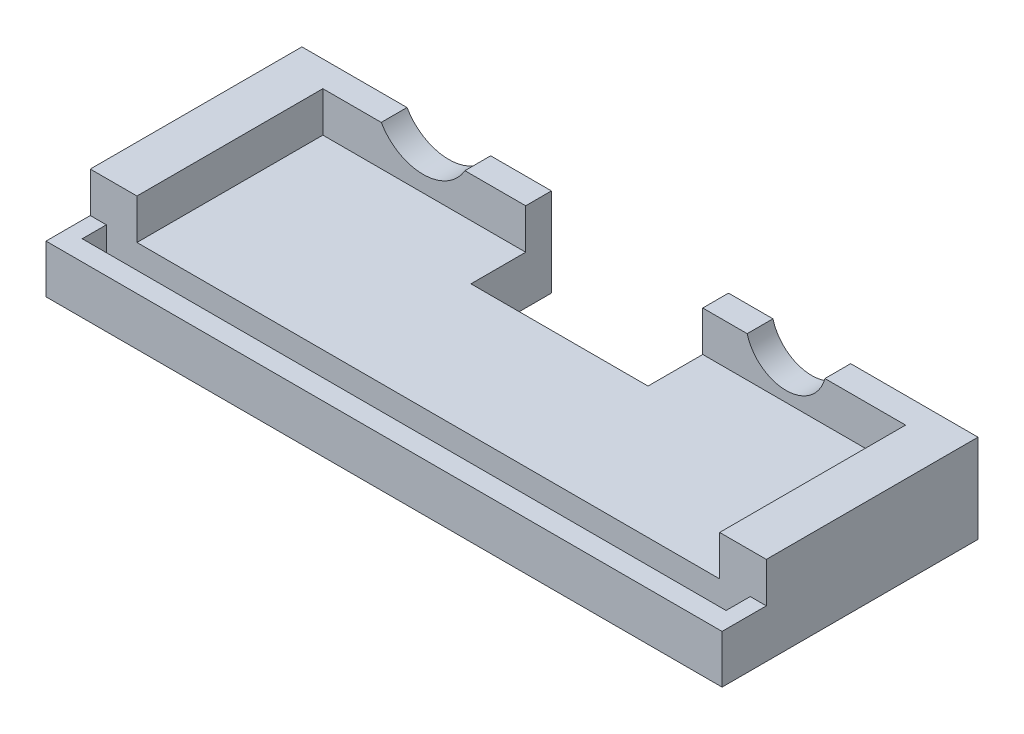
ISO-10303-21;
HEADER;
FILE_DESCRIPTION(('STEP AP214'),'2;1');
FILE_NAME('part.step','',(''),(''),'','','');
FILE_SCHEMA(('AUTOMOTIVE_DESIGN { 1 0 10303 214 1 1 1 1 }'));
ENDSEC;
DATA;
#1=APPLICATION_CONTEXT('core data for automotive mechanical design processes');
#2=APPLICATION_PROTOCOL_DEFINITION('international standard','automotive_design',2000,#1);
#3=PRODUCT_CONTEXT('',#1,'mechanical');
#4=PRODUCT('Part','Part','',(#3));
#5=PRODUCT_RELATED_PRODUCT_CATEGORY('part','',(#4));
#6=PRODUCT_DEFINITION_FORMATION('','',#4);
#7=PRODUCT_DEFINITION_CONTEXT('part definition',#1,'design');
#8=PRODUCT_DEFINITION('design','',#6,#7);
#9=PRODUCT_DEFINITION_SHAPE('','',#8);
#10=(LENGTH_UNIT() NAMED_UNIT(*) SI_UNIT(.MILLI.,.METRE.));
#11=(NAMED_UNIT(*) PLANE_ANGLE_UNIT() SI_UNIT($,.RADIAN.));
#12=(NAMED_UNIT(*) SI_UNIT($,.STERADIAN.) SOLID_ANGLE_UNIT());
#13=UNCERTAINTY_MEASURE_WITH_UNIT(LENGTH_MEASURE(1.E-05),#10,'distance_accuracy_value','');
#14=(GEOMETRIC_REPRESENTATION_CONTEXT(3) GLOBAL_UNCERTAINTY_ASSIGNED_CONTEXT((#13)) GLOBAL_UNIT_ASSIGNED_CONTEXT((#10,
#11,#12)) REPRESENTATION_CONTEXT('',''));
#15=CARTESIAN_POINT('',(0.,0.,0.));
#16=DIRECTION('',(0.,0.,1.));
#17=DIRECTION('',(1.,0.,0.));
#18=AXIS2_PLACEMENT_3D('',#15,#16,#17);
#19=CARTESIAN_POINT('',(0.,6.,0.));
#20=DIRECTION('',(0.,1.,0.));
#21=DIRECTION('',(0.,0.,1.));
#22=AXIS2_PLACEMENT_3D('',#19,#20,#21);
#23=PLANE('',#22);
#24=DIRECTION('',(1.,0.,0.));
#25=VECTOR('',#24,1.);
#26=CARTESIAN_POINT('',(0.,6.,3.2));
#27=LINE('',#26,#25);
#28=CARTESIAN_POINT('',(53.,6.,3.2));
#29=VERTEX_POINT('',#28);
#30=CARTESIAN_POINT('',(78.2,6.,3.2));
#31=VERTEX_POINT('',#30);
#32=EDGE_CURVE('E263',#29,#31,#27,.T.);
#33=ORIENTED_EDGE('',*,*,#32,.F.);
#34=DIRECTION('',(0.,0.,1.));
#35=VECTOR('',#34,1.);
#36=CARTESIAN_POINT('',(53.,6.,0.));
#37=LINE('',#36,#35);
#38=CARTESIAN_POINT('',(53.,6.,10.));
#39=VERTEX_POINT('',#38);
#40=EDGE_CURVE('E372',#29,#39,#37,.T.);
#41=ORIENTED_EDGE('',*,*,#40,.T.);
#42=DIRECTION('',(1.,0.,0.));
#43=VECTOR('',#42,1.);
#44=CARTESIAN_POINT('',(0.,6.,10.));
#45=LINE('',#44,#43);
#46=CARTESIAN_POINT('',(31.,6.,10.));
#47=VERTEX_POINT('',#46);
#48=EDGE_CURVE('E220',#47,#39,#45,.T.);
#49=ORIENTED_EDGE('',*,*,#48,.F.);
#50=DIRECTION('',(0.,0.,1.));
#51=VECTOR('',#50,1.);
#52=CARTESIAN_POINT('',(31.,6.,0.));
#53=LINE('',#52,#51);
#54=CARTESIAN_POINT('',(31.,6.,3.2));
#55=VERTEX_POINT('',#54);
#56=EDGE_CURVE('E375',#55,#47,#53,.T.);
#57=ORIENTED_EDGE('',*,*,#56,.F.);
#58=DIRECTION('',(1.,0.,0.));
#59=VECTOR('',#58,1.);
#60=CARTESIAN_POINT('',(0.,6.,3.2));
#61=LINE('',#60,#59);
#62=CARTESIAN_POINT('',(5.8,6.,3.2));
#63=VERTEX_POINT('',#62);
#64=EDGE_CURVE('E282',#63,#55,#61,.T.);
#65=ORIENTED_EDGE('',*,*,#64,.F.);
#66=DIRECTION('',(0.,0.,1.));
#67=VECTOR('',#66,1.);
#68=CARTESIAN_POINT('',(5.8,6.,0.));
#69=LINE('',#68,#67);
#70=CARTESIAN_POINT('',(5.8,6.,26.3));
#71=VERTEX_POINT('',#70);
#72=EDGE_CURVE('E279',#63,#71,#69,.T.);
#73=ORIENTED_EDGE('',*,*,#72,.T.);
#74=DIRECTION('',(1.,0.,0.));
#75=VECTOR('',#74,1.);
#76=CARTESIAN_POINT('',(2.,6.,26.3));
#77=LINE('',#76,#75);
#78=CARTESIAN_POINT('',(78.2,6.,26.3));
#79=VERTEX_POINT('',#78);
#80=EDGE_CURVE('E311',#71,#79,#77,.T.);
#81=ORIENTED_EDGE('',*,*,#80,.T.);
#82=DIRECTION('',(0.,0.,1.));
#83=VECTOR('',#82,1.);
#84=CARTESIAN_POINT('',(78.2,6.,0.));
#85=LINE('',#84,#83);
#86=EDGE_CURVE('E403',#31,#79,#85,.T.);
#87=ORIENTED_EDGE('',*,*,#86,.F.);
#88=EDGE_LOOP('',(#33,#41,#49,#57,#65,#73,#81,#87));
#89=FACE_BOUND('',#88,.T.);
#90=ADVANCED_FACE('F37',(#89),#23,.T.);
#91=CARTESIAN_POINT('',(0.,6.,0.));
#92=DIRECTION('',(0.,0.,-1.));
#93=DIRECTION('',(-1.,0.,0.));
#94=AXIS2_PLACEMENT_3D('',#91,#92,#93);
#95=PLANE('',#94);
#96=DIRECTION('',(1.,0.,0.));
#97=VECTOR('',#96,1.);
#98=CARTESIAN_POINT('',(0.,0.,0.));
#99=LINE('',#98,#97);
#100=CARTESIAN_POINT('',(53.,0.,0.));
#101=VERTEX_POINT('',#100);
#102=CARTESIAN_POINT('',(84.,0.,0.));
#103=VERTEX_POINT('',#102);
#104=EDGE_CURVE('E214',#101,#103,#99,.T.);
#105=ORIENTED_EDGE('',*,*,#104,.F.);
#106=DIRECTION('',(0.,-1.,0.));
#107=VECTOR('',#106,1.);
#108=CARTESIAN_POINT('',(53.,11.,0.));
#109=LINE('',#108,#107);
#110=CARTESIAN_POINT('',(53.,11.,0.));
#111=VERTEX_POINT('',#110);
#112=EDGE_CURVE('E197',#111,#101,#109,.T.);
#113=ORIENTED_EDGE('',*,*,#112,.F.);
#114=DIRECTION('',(-1.,0.,0.));
#115=VECTOR('',#114,1.);
#116=CARTESIAN_POINT('',(0.,11.,0.));
#117=LINE('',#116,#115);
#118=CARTESIAN_POINT('',(58.5219569181707,11.,0.));
#119=VERTEX_POINT('',#118);
#120=EDGE_CURVE('E389',#119,#111,#117,.T.);
#121=ORIENTED_EDGE('',*,*,#120,.F.);
#122=CARTESIAN_POINT('',(63.35,12.3,0.));
#123=DIRECTION('',(0.,0.,-1.));
#124=DIRECTION('',(-1.,0.,0.));
#125=AXIS2_PLACEMENT_3D('',#122,#123,#124);
#126=CIRCLE('',#125,5.);
#127=CARTESIAN_POINT('',(68.1780430818293,11.,0.));
#128=VERTEX_POINT('',#127);
#129=EDGE_CURVE('E59',#128,#119,#126,.T.);
#130=ORIENTED_EDGE('',*,*,#129,.F.);
#131=CARTESIAN_POINT('',(84.,11.,0.));
#132=VERTEX_POINT('',#131);
#133=EDGE_CURVE('E386',#132,#128,#117,.T.);
#134=ORIENTED_EDGE('',*,*,#133,.F.);
#135=DIRECTION('',(0.,-1.,0.));
#136=VECTOR('',#135,1.);
#137=CARTESIAN_POINT('',(84.,6.,0.));
#138=LINE('',#137,#136);
#139=EDGE_CURVE('E224',#132,#103,#138,.T.);
#140=ORIENTED_EDGE('',*,*,#139,.T.);
#141=EDGE_LOOP('',(#105,#113,#121,#130,#134,#140));
#142=FACE_BOUND('',#141,.T.);
#143=ADVANCED_FACE('F222',(#142),#95,.T.);
#144=CARTESIAN_POINT('',(0.,0.,0.));
#145=DIRECTION('',(0.,1.,0.));
#146=DIRECTION('',(0.,0.,1.));
#147=AXIS2_PLACEMENT_3D('',#144,#145,#146);
#148=PLANE('',#147);
#149=DIRECTION('',(0.,0.,1.));
#150=VECTOR('',#149,1.);
#151=CARTESIAN_POINT('',(53.,0.,0.));
#152=LINE('',#151,#150);
#153=CARTESIAN_POINT('',(53.,0.,10.));
#154=VERTEX_POINT('',#153);
#155=EDGE_CURVE('E200',#101,#154,#152,.T.);
#156=ORIENTED_EDGE('',*,*,#155,.F.);
#157=ORIENTED_EDGE('',*,*,#104,.T.);
#158=DIRECTION('',(0.,0.,1.));
#159=VECTOR('',#158,1.);
#160=CARTESIAN_POINT('',(84.,0.,0.));
#161=LINE('',#160,#159);
#162=CARTESIAN_POINT('',(84.,0.,31.8));
#163=VERTEX_POINT('',#162);
#164=EDGE_CURVE('E227',#103,#163,#161,.T.);
#165=ORIENTED_EDGE('',*,*,#164,.T.);
#166=DIRECTION('',(1.,0.,0.));
#167=VECTOR('',#166,1.);
#168=CARTESIAN_POINT('',(0.,0.,31.8));
#169=LINE('',#168,#167);
#170=CARTESIAN_POINT('',(0.,0.,31.8));
#171=VERTEX_POINT('',#170);
#172=EDGE_CURVE('E231',#171,#163,#169,.T.);
#173=ORIENTED_EDGE('',*,*,#172,.F.);
#174=DIRECTION('',(0.,0.,1.));
#175=VECTOR('',#174,1.);
#176=CARTESIAN_POINT('',(0.,0.,0.));
#177=LINE('',#176,#175);
#178=CARTESIAN_POINT('',(0.,0.,0.));
#179=VERTEX_POINT('',#178);
#180=EDGE_CURVE('E326',#179,#171,#177,.T.);
#181=ORIENTED_EDGE('',*,*,#180,.F.);
#182=CARTESIAN_POINT('',(31.,0.,0.));
#183=VERTEX_POINT('',#182);
#184=EDGE_CURVE('E226',#179,#183,#99,.T.);
#185=ORIENTED_EDGE('',*,*,#184,.T.);
#186=DIRECTION('',(0.,0.,1.));
#187=VECTOR('',#186,1.);
#188=CARTESIAN_POINT('',(31.,0.,0.));
#189=LINE('',#188,#187);
#190=CARTESIAN_POINT('',(31.,0.,10.));
#191=VERTEX_POINT('',#190);
#192=EDGE_CURVE('E219',#183,#191,#189,.T.);
#193=ORIENTED_EDGE('',*,*,#192,.T.);
#194=DIRECTION('',(1.,0.,0.));
#195=VECTOR('',#194,1.);
#196=CARTESIAN_POINT('',(0.,0.,10.));
#197=LINE('',#196,#195);
#198=EDGE_CURVE('E218',#191,#154,#197,.T.);
#199=ORIENTED_EDGE('',*,*,#198,.T.);
#200=EDGE_LOOP('',(#156,#157,#165,#173,#181,#185,#193,#199));
#201=FACE_BOUND('',#200,.T.);
#202=ADVANCED_FACE('F212',(#201),#148,.F.);
#203=CARTESIAN_POINT('',(0.,11.,0.));
#204=DIRECTION('',(0.,1.,0.));
#205=DIRECTION('',(0.,0.,1.));
#206=AXIS2_PLACEMENT_3D('',#203,#204,#205);
#207=PLANE('',#206);
#208=DIRECTION('',(0.,0.,-1.));
#209=VECTOR('',#208,1.);
#210=CARTESIAN_POINT('',(23.4461524227066,11.,31.8));
#211=LINE('',#210,#209);
#212=CARTESIAN_POINT('',(23.4461524227066,11.,3.2));
#213=VERTEX_POINT('',#212);
#214=CARTESIAN_POINT('',(23.4461524227066,11.,0.));
#215=VERTEX_POINT('',#214);
#216=EDGE_CURVE('E11',#213,#215,#211,.T.);
#217=ORIENTED_EDGE('',*,*,#216,.F.);
#218=DIRECTION('',(1.,0.,0.));
#219=VECTOR('',#218,1.);
#220=CARTESIAN_POINT('',(0.,11.,3.2));
#221=LINE('',#220,#219);
#222=CARTESIAN_POINT('',(31.,11.,3.2));
#223=VERTEX_POINT('',#222);
#224=EDGE_CURVE('E262',#213,#223,#221,.T.);
#225=ORIENTED_EDGE('',*,*,#224,.T.);
#226=DIRECTION('',(0.,0.,1.));
#227=VECTOR('',#226,1.);
#228=CARTESIAN_POINT('',(31.,11.,0.));
#229=LINE('',#228,#227);
#230=CARTESIAN_POINT('',(31.,11.,0.));
#231=VERTEX_POINT('',#230);
#232=EDGE_CURVE('E284',#231,#223,#229,.T.);
#233=ORIENTED_EDGE('',*,*,#232,.F.);
#234=DIRECTION('',(-1.,0.,0.));
#235=VECTOR('',#234,1.);
#236=CARTESIAN_POINT('',(0.,11.,0.));
#237=LINE('',#236,#235);
#238=EDGE_CURVE('E362',#231,#215,#237,.T.);
#239=ORIENTED_EDGE('',*,*,#238,.T.);
#240=EDGE_LOOP('',(#217,#225,#233,#239));
#241=FACE_BOUND('',#240,.T.);
#242=ADVANCED_FACE('F431',(#241),#207,.T.);
#243=CARTESIAN_POINT('',(0.,11.,0.));
#244=DIRECTION('',(0.,1.,0.));
#245=DIRECTION('',(0.,0.,1.));
#246=AXIS2_PLACEMENT_3D('',#243,#244,#245);
#247=PLANE('',#246);
#248=DIRECTION('',(0.,0.,-1.));
#249=VECTOR('',#248,1.);
#250=CARTESIAN_POINT('',(68.1780430818293,11.,31.8));
#251=LINE('',#250,#249);
#252=CARTESIAN_POINT('',(68.1780430818293,11.,3.2));
#253=VERTEX_POINT('',#252);
#254=EDGE_CURVE('E246',#253,#128,#251,.T.);
#255=ORIENTED_EDGE('',*,*,#254,.F.);
#256=DIRECTION('',(1.,0.,0.));
#257=VECTOR('',#256,1.);
#258=CARTESIAN_POINT('',(0.,11.,3.2));
#259=LINE('',#258,#257);
#260=CARTESIAN_POINT('',(78.2,11.,3.2));
#261=VERTEX_POINT('',#260);
#262=EDGE_CURVE('E391',#253,#261,#259,.T.);
#263=ORIENTED_EDGE('',*,*,#262,.T.);
#264=DIRECTION('',(0.,0.,1.));
#265=VECTOR('',#264,1.);
#266=CARTESIAN_POINT('',(78.2,11.,0.));
#267=LINE('',#266,#265);
#268=CARTESIAN_POINT('',(78.2,11.,26.3));
#269=VERTEX_POINT('',#268);
#270=EDGE_CURVE('E395',#261,#269,#267,.T.);
#271=ORIENTED_EDGE('',*,*,#270,.T.);
#272=DIRECTION('',(1.,0.,0.));
#273=VECTOR('',#272,1.);
#274=CARTESIAN_POINT('',(0.,11.,26.3));
#275=LINE('',#274,#273);
#276=CARTESIAN_POINT('',(84.,11.,26.3));
#277=VERTEX_POINT('',#276);
#278=EDGE_CURVE('E397',#269,#277,#275,.T.);
#279=ORIENTED_EDGE('',*,*,#278,.T.);
#280=DIRECTION('',(0.,0.,-1.));
#281=VECTOR('',#280,1.);
#282=CARTESIAN_POINT('',(84.,11.,0.));
#283=LINE('',#282,#281);
#284=EDGE_CURVE('E399',#277,#132,#283,.T.);
#285=ORIENTED_EDGE('',*,*,#284,.T.);
#286=ORIENTED_EDGE('',*,*,#133,.T.);
#287=EDGE_LOOP('',(#255,#263,#271,#279,#285,#286));
#288=FACE_BOUND('',#287,.T.);
#289=ADVANCED_FACE('F463',(#288),#247,.T.);
#290=DIRECTION('',(0.,0.,1.));
#291=VECTOR('',#290,1.);
#292=CARTESIAN_POINT('',(84.,6.,0.));
#293=LINE('',#292,#291);
#294=CARTESIAN_POINT('',(84.,6.,26.3));
#295=VERTEX_POINT('',#294);
#296=CARTESIAN_POINT('',(84.,6.,31.8));
#297=VERTEX_POINT('',#296);
#298=EDGE_CURVE('E237',#295,#297,#293,.T.);
#299=ORIENTED_EDGE('',*,*,#298,.F.);
#300=DIRECTION('',(1.,0.,0.));
#301=VECTOR('',#300,1.);
#302=CARTESIAN_POINT('',(0.,6.,26.3));
#303=LINE('',#302,#301);
#304=CARTESIAN_POINT('',(82.,6.,26.3));
#305=VERTEX_POINT('',#304);
#306=EDGE_CURVE('E406',#305,#295,#303,.T.);
#307=ORIENTED_EDGE('',*,*,#306,.F.);
#308=DIRECTION('',(0.,0.,-1.));
#309=VECTOR('',#308,1.);
#310=CARTESIAN_POINT('',(82.,6.,29.3));
#311=LINE('',#310,#309);
#312=CARTESIAN_POINT('',(82.,6.,29.3));
#313=VERTEX_POINT('',#312);
#314=EDGE_CURVE('E313',#313,#305,#311,.T.);
#315=ORIENTED_EDGE('',*,*,#314,.F.);
#316=DIRECTION('',(1.,0.,0.));
#317=VECTOR('',#316,1.);
#318=CARTESIAN_POINT('',(2.,6.,29.3));
#319=LINE('',#318,#317);
#320=CARTESIAN_POINT('',(2.,6.,29.3));
#321=VERTEX_POINT('',#320);
#322=EDGE_CURVE('E300',#321,#313,#319,.T.);
#323=ORIENTED_EDGE('',*,*,#322,.F.);
#324=DIRECTION('',(0.,0.,-1.));
#325=VECTOR('',#324,1.);
#326=CARTESIAN_POINT('',(2.,6.,29.3));
#327=LINE('',#326,#325);
#328=CARTESIAN_POINT('',(2.,6.,26.3));
#329=VERTEX_POINT('',#328);
#330=EDGE_CURVE('E295',#321,#329,#327,.T.);
#331=ORIENTED_EDGE('',*,*,#330,.T.);
#332=DIRECTION('',(1.,0.,0.));
#333=VECTOR('',#332,1.);
#334=CARTESIAN_POINT('',(0.,6.,26.3));
#335=LINE('',#334,#333);
#336=CARTESIAN_POINT('',(0.,6.,26.3));
#337=VERTEX_POINT('',#336);
#338=EDGE_CURVE('E207',#337,#329,#335,.T.);
#339=ORIENTED_EDGE('',*,*,#338,.F.);
#340=DIRECTION('',(0.,0.,1.));
#341=VECTOR('',#340,1.);
#342=CARTESIAN_POINT('',(0.,6.,0.));
#343=LINE('',#342,#341);
#344=CARTESIAN_POINT('',(0.,6.,31.8));
#345=VERTEX_POINT('',#344);
#346=EDGE_CURVE('E230',#337,#345,#343,.T.);
#347=ORIENTED_EDGE('',*,*,#346,.T.);
#348=DIRECTION('',(1.,0.,0.));
#349=VECTOR('',#348,1.);
#350=CARTESIAN_POINT('',(0.,6.,31.8));
#351=LINE('',#350,#349);
#352=EDGE_CURVE('E328',#345,#297,#351,.T.);
#353=ORIENTED_EDGE('',*,*,#352,.T.);
#354=EDGE_LOOP('',(#299,#307,#315,#323,#331,#339,#347,#353));
#355=FACE_BOUND('',#354,.T.);
#356=ADVANCED_FACE('F350',(#355),#23,.T.);
#357=CARTESIAN_POINT('',(0.,6.,0.));
#358=DIRECTION('',(1.,0.,0.));
#359=DIRECTION('',(0.,0.,-1.));
#360=AXIS2_PLACEMENT_3D('',#357,#358,#359);
#361=PLANE('',#360);
#362=ORIENTED_EDGE('',*,*,#180,.T.);
#363=DIRECTION('',(0.,-1.,0.));
#364=VECTOR('',#363,1.);
#365=CARTESIAN_POINT('',(0.,6.,31.8));
#366=LINE('',#365,#364);
#367=EDGE_CURVE('E241',#345,#171,#366,.T.);
#368=ORIENTED_EDGE('',*,*,#367,.F.);
#369=ORIENTED_EDGE('',*,*,#346,.F.);
#370=DIRECTION('',(0.,-1.,0.));
#371=VECTOR('',#370,1.);
#372=CARTESIAN_POINT('',(0.,11.,26.3));
#373=LINE('',#372,#371);
#374=CARTESIAN_POINT('',(0.,11.,26.3));
#375=VERTEX_POINT('',#374);
#376=EDGE_CURVE('E290',#375,#337,#373,.T.);
#377=ORIENTED_EDGE('',*,*,#376,.F.);
#378=DIRECTION('',(0.,0.,1.));
#379=VECTOR('',#378,1.);
#380=CARTESIAN_POINT('',(0.,11.,0.));
#381=LINE('',#380,#379);
#382=CARTESIAN_POINT('',(0.,11.,0.));
#383=VERTEX_POINT('',#382);
#384=EDGE_CURVE('E420',#383,#375,#381,.T.);
#385=ORIENTED_EDGE('',*,*,#384,.F.);
#386=DIRECTION('',(0.,-1.,0.));
#387=VECTOR('',#386,1.);
#388=CARTESIAN_POINT('',(0.,6.,0.));
#389=LINE('',#388,#387);
#390=EDGE_CURVE('E235',#383,#179,#389,.T.);
#391=ORIENTED_EDGE('',*,*,#390,.T.);
#392=EDGE_LOOP('',(#362,#368,#369,#377,#385,#391));
#393=FACE_BOUND('',#392,.T.);
#394=ADVANCED_FACE('F39',(#393),#361,.F.);
#395=CARTESIAN_POINT('',(0.,6.,31.8));
#396=DIRECTION('',(0.,0.,-1.));
#397=DIRECTION('',(-1.,0.,0.));
#398=AXIS2_PLACEMENT_3D('',#395,#396,#397);
#399=PLANE('',#398);
#400=ORIENTED_EDGE('',*,*,#172,.T.);
#401=DIRECTION('',(0.,-1.,0.));
#402=VECTOR('',#401,1.);
#403=CARTESIAN_POINT('',(84.,6.,31.8));
#404=LINE('',#403,#402);
#405=EDGE_CURVE('E239',#297,#163,#404,.T.);
#406=ORIENTED_EDGE('',*,*,#405,.F.);
#407=ORIENTED_EDGE('',*,*,#352,.F.);
#408=ORIENTED_EDGE('',*,*,#367,.T.);
#409=EDGE_LOOP('',(#400,#406,#407,#408));
#410=FACE_BOUND('',#409,.T.);
#411=ADVANCED_FACE('F336',(#410),#399,.F.);
#412=CARTESIAN_POINT('',(84.,6.,0.));
#413=DIRECTION('',(1.,0.,0.));
#414=DIRECTION('',(0.,0.,-1.));
#415=AXIS2_PLACEMENT_3D('',#412,#413,#414);
#416=PLANE('',#415);
#417=ORIENTED_EDGE('',*,*,#164,.F.);
#418=ORIENTED_EDGE('',*,*,#139,.F.);
#419=ORIENTED_EDGE('',*,*,#284,.F.);
#420=DIRECTION('',(0.,-1.,0.));
#421=VECTOR('',#420,1.);
#422=CARTESIAN_POINT('',(84.,11.,26.3));
#423=LINE('',#422,#421);
#424=EDGE_CURVE('E346',#277,#295,#423,.T.);
#425=ORIENTED_EDGE('',*,*,#424,.T.);
#426=ORIENTED_EDGE('',*,*,#298,.T.);
#427=ORIENTED_EDGE('',*,*,#405,.T.);
#428=EDGE_LOOP('',(#417,#418,#419,#425,#426,#427));
#429=FACE_BOUND('',#428,.T.);
#430=ADVANCED_FACE('F341',(#429),#416,.T.);
#431=DIRECTION('',(0.,-1.,0.));
#432=VECTOR('',#431,1.);
#433=CARTESIAN_POINT('',(31.,11.,0.));
#434=LINE('',#433,#432);
#435=EDGE_CURVE('E293',#231,#183,#434,.T.);
#436=ORIENTED_EDGE('',*,*,#435,.T.);
#437=ORIENTED_EDGE('',*,*,#184,.F.);
#438=ORIENTED_EDGE('',*,*,#390,.F.);
#439=CARTESIAN_POINT('',(13.0538475772934,11.,0.));
#440=VERTEX_POINT('',#439);
#441=EDGE_CURVE('E418',#440,#383,#237,.T.);
#442=ORIENTED_EDGE('',*,*,#441,.F.);
#443=CARTESIAN_POINT('',(18.25,14.,0.));
#444=DIRECTION('',(0.,0.,-1.));
#445=DIRECTION('',(-1.,0.,0.));
#446=AXIS2_PLACEMENT_3D('',#443,#444,#445);
#447=CIRCLE('',#446,6.);
#448=EDGE_CURVE('E51',#215,#440,#447,.T.);
#449=ORIENTED_EDGE('',*,*,#448,.F.);
#450=ORIENTED_EDGE('',*,*,#238,.F.);
#451=EDGE_LOOP('',(#436,#437,#438,#442,#449,#450));
#452=FACE_BOUND('',#451,.T.);
#453=ADVANCED_FACE('F358',(#452),#95,.T.);
#454=CARTESIAN_POINT('',(2.,3.,29.3));
#455=DIRECTION('',(1.,0.,0.));
#456=DIRECTION('',(0.,0.,-1.));
#457=AXIS2_PLACEMENT_3D('',#454,#455,#456);
#458=PLANE('',#457);
#459=ORIENTED_EDGE('',*,*,#330,.F.);
#460=DIRECTION('',(0.,1.,0.));
#461=VECTOR('',#460,1.);
#462=CARTESIAN_POINT('',(2.,3.,29.3));
#463=LINE('',#462,#461);
#464=CARTESIAN_POINT('',(2.,3.,29.3));
#465=VERTEX_POINT('',#464);
#466=EDGE_CURVE('E308',#465,#321,#463,.T.);
#467=ORIENTED_EDGE('',*,*,#466,.F.);
#468=DIRECTION('',(0.,0.,-1.));
#469=VECTOR('',#468,1.);
#470=CARTESIAN_POINT('',(2.,3.,29.3));
#471=LINE('',#470,#469);
#472=CARTESIAN_POINT('',(2.,3.,26.3));
#473=VERTEX_POINT('',#472);
#474=EDGE_CURVE('E296',#465,#473,#471,.T.);
#475=ORIENTED_EDGE('',*,*,#474,.T.);
#476=DIRECTION('',(0.,1.,0.));
#477=VECTOR('',#476,1.);
#478=CARTESIAN_POINT('',(2.,3.,26.3));
#479=LINE('',#478,#477);
#480=EDGE_CURVE('E324',#473,#329,#479,.T.);
#481=ORIENTED_EDGE('',*,*,#480,.T.);
#482=EDGE_LOOP('',(#459,#467,#475,#481));
#483=FACE_BOUND('',#482,.T.);
#484=ADVANCED_FACE('F494',(#483),#458,.T.);
#485=CARTESIAN_POINT('',(2.,3.,26.3));
#486=DIRECTION('',(0.,0.,1.));
#487=DIRECTION('',(1.,0.,0.));
#488=AXIS2_PLACEMENT_3D('',#485,#486,#487);
#489=PLANE('',#488);
#490=ORIENTED_EDGE('',*,*,#80,.F.);
#491=DIRECTION('',(0.,-1.,0.));
#492=VECTOR('',#491,1.);
#493=CARTESIAN_POINT('',(5.8,11.,26.3));
#494=LINE('',#493,#492);
#495=CARTESIAN_POINT('',(5.8,11.,26.3));
#496=VERTEX_POINT('',#495);
#497=EDGE_CURVE('E287',#496,#71,#494,.T.);
#498=ORIENTED_EDGE('',*,*,#497,.F.);
#499=DIRECTION('',(1.,0.,0.));
#500=VECTOR('',#499,1.);
#501=CARTESIAN_POINT('',(0.,11.,26.3));
#502=LINE('',#501,#500);
#503=EDGE_CURVE('E421',#375,#496,#502,.T.);
#504=ORIENTED_EDGE('',*,*,#503,.F.);
#505=ORIENTED_EDGE('',*,*,#376,.T.);
#506=ORIENTED_EDGE('',*,*,#338,.T.);
#507=ORIENTED_EDGE('',*,*,#480,.F.);
#508=DIRECTION('',(1.,0.,0.));
#509=VECTOR('',#508,1.);
#510=CARTESIAN_POINT('',(2.,3.,26.3));
#511=LINE('',#510,#509);
#512=CARTESIAN_POINT('',(82.,3.,26.3));
#513=VERTEX_POINT('',#512);
#514=EDGE_CURVE('E299',#473,#513,#511,.T.);
#515=ORIENTED_EDGE('',*,*,#514,.T.);
#516=DIRECTION('',(0.,1.,0.));
#517=VECTOR('',#516,1.);
#518=CARTESIAN_POINT('',(82.,3.,26.3));
#519=LINE('',#518,#517);
#520=EDGE_CURVE('E321',#513,#305,#519,.T.);
#521=ORIENTED_EDGE('',*,*,#520,.T.);
#522=ORIENTED_EDGE('',*,*,#306,.T.);
#523=ORIENTED_EDGE('',*,*,#424,.F.);
#524=ORIENTED_EDGE('',*,*,#278,.F.);
#525=DIRECTION('',(0.,-1.,0.));
#526=VECTOR('',#525,1.);
#527=CARTESIAN_POINT('',(78.2,11.,26.3));
#528=LINE('',#527,#526);
#529=EDGE_CURVE('E409',#269,#79,#528,.T.);
#530=ORIENTED_EDGE('',*,*,#529,.T.);
#531=EDGE_LOOP('',(#490,#498,#504,#505,#506,#507,#515,#521,#522,#523,#524,#530));
#532=FACE_BOUND('',#531,.T.);
#533=ADVANCED_FACE('F433',(#532),#489,.T.);
#534=CARTESIAN_POINT('',(82.,3.,29.3));
#535=DIRECTION('',(1.,0.,0.));
#536=DIRECTION('',(0.,0.,-1.));
#537=AXIS2_PLACEMENT_3D('',#534,#535,#536);
#538=PLANE('',#537);
#539=ORIENTED_EDGE('',*,*,#314,.T.);
#540=ORIENTED_EDGE('',*,*,#520,.F.);
#541=DIRECTION('',(0.,0.,-1.));
#542=VECTOR('',#541,1.);
#543=CARTESIAN_POINT('',(82.,3.,29.3));
#544=LINE('',#543,#542);
#545=CARTESIAN_POINT('',(82.,3.,29.3));
#546=VERTEX_POINT('',#545);
#547=EDGE_CURVE('E302',#546,#513,#544,.T.);
#548=ORIENTED_EDGE('',*,*,#547,.F.);
#549=DIRECTION('',(0.,1.,0.));
#550=VECTOR('',#549,1.);
#551=CARTESIAN_POINT('',(82.,3.,29.3));
#552=LINE('',#551,#550);
#553=EDGE_CURVE('E319',#546,#313,#552,.T.);
#554=ORIENTED_EDGE('',*,*,#553,.T.);
#555=EDGE_LOOP('',(#539,#540,#548,#554));
#556=FACE_BOUND('',#555,.T.);
#557=ADVANCED_FACE('F487',(#556),#538,.F.);
#558=CARTESIAN_POINT('',(2.,3.,29.3));
#559=DIRECTION('',(0.,0.,1.));
#560=DIRECTION('',(1.,0.,0.));
#561=AXIS2_PLACEMENT_3D('',#558,#559,#560);
#562=PLANE('',#561);
#563=ORIENTED_EDGE('',*,*,#322,.T.);
#564=ORIENTED_EDGE('',*,*,#553,.F.);
#565=DIRECTION('',(1.,0.,0.));
#566=VECTOR('',#565,1.);
#567=CARTESIAN_POINT('',(2.,3.,29.3));
#568=LINE('',#567,#566);
#569=EDGE_CURVE('E305',#465,#546,#568,.T.);
#570=ORIENTED_EDGE('',*,*,#569,.F.);
#571=ORIENTED_EDGE('',*,*,#466,.T.);
#572=EDGE_LOOP('',(#563,#564,#570,#571));
#573=FACE_BOUND('',#572,.T.);
#574=ADVANCED_FACE('F491',(#573),#562,.F.);
#575=CARTESIAN_POINT('',(0.,3.,0.));
#576=DIRECTION('',(0.,-1.,0.));
#577=DIRECTION('',(0.,0.,-1.));
#578=AXIS2_PLACEMENT_3D('',#575,#576,#577);
#579=PLANE('',#578);
#580=ORIENTED_EDGE('',*,*,#474,.F.);
#581=ORIENTED_EDGE('',*,*,#569,.T.);
#582=ORIENTED_EDGE('',*,*,#547,.T.);
#583=ORIENTED_EDGE('',*,*,#514,.F.);
#584=EDGE_LOOP('',(#580,#581,#582,#583));
#585=FACE_BOUND('',#584,.T.);
#586=ADVANCED_FACE('F497',(#585),#579,.F.);
#587=CARTESIAN_POINT('',(31.,11.,0.));
#588=DIRECTION('',(1.,0.,0.));
#589=DIRECTION('',(0.,0.,-1.));
#590=AXIS2_PLACEMENT_3D('',#587,#588,#589);
#591=PLANE('',#590);
#592=DIRECTION('',(0.,-1.,0.));
#593=VECTOR('',#592,1.);
#594=CARTESIAN_POINT('',(31.,11.,3.2));
#595=LINE('',#594,#593);
#596=EDGE_CURVE('E269',#223,#55,#595,.T.);
#597=ORIENTED_EDGE('',*,*,#596,.T.);
#598=ORIENTED_EDGE('',*,*,#56,.T.);
#599=DIRECTION('',(0.,1.,0.));
#600=VECTOR('',#599,1.);
#601=CARTESIAN_POINT('',(31.,0.,10.));
#602=LINE('',#601,#600);
#603=EDGE_CURVE('E368',#191,#47,#602,.T.);
#604=ORIENTED_EDGE('',*,*,#603,.F.);
#605=ORIENTED_EDGE('',*,*,#192,.F.);
#606=ORIENTED_EDGE('',*,*,#435,.F.);
#607=ORIENTED_EDGE('',*,*,#232,.T.);
#608=EDGE_LOOP('',(#597,#598,#604,#605,#606,#607));
#609=FACE_BOUND('',#608,.T.);
#610=ADVANCED_FACE('F366',(#609),#591,.T.);
#611=CARTESIAN_POINT('',(5.8,11.,0.));
#612=DIRECTION('',(1.,0.,0.));
#613=DIRECTION('',(0.,0.,-1.));
#614=AXIS2_PLACEMENT_3D('',#611,#612,#613);
#615=PLANE('',#614);
#616=ORIENTED_EDGE('',*,*,#72,.F.);
#617=DIRECTION('',(0.,-1.,0.));
#618=VECTOR('',#617,1.);
#619=CARTESIAN_POINT('',(5.8,11.,3.2));
#620=LINE('',#619,#618);
#621=CARTESIAN_POINT('',(5.8,11.,3.2));
#622=VERTEX_POINT('',#621);
#623=EDGE_CURVE('E272',#622,#63,#620,.T.);
#624=ORIENTED_EDGE('',*,*,#623,.F.);
#625=DIRECTION('',(0.,0.,1.));
#626=VECTOR('',#625,1.);
#627=CARTESIAN_POINT('',(5.8,11.,0.));
#628=LINE('',#627,#626);
#629=EDGE_CURVE('E268',#622,#496,#628,.T.);
#630=ORIENTED_EDGE('',*,*,#629,.T.);
#631=ORIENTED_EDGE('',*,*,#497,.T.);
#632=EDGE_LOOP('',(#616,#624,#630,#631));
#633=FACE_BOUND('',#632,.T.);
#634=ADVANCED_FACE('F426',(#633),#615,.T.);
#635=CARTESIAN_POINT('',(0.,11.,3.2));
#636=DIRECTION('',(0.,0.,-1.));
#637=DIRECTION('',(-1.,0.,0.));
#638=AXIS2_PLACEMENT_3D('',#635,#636,#637);
#639=PLANE('',#638);
#640=ORIENTED_EDGE('',*,*,#224,.F.);
#641=CARTESIAN_POINT('',(18.25,14.,3.2));
#642=DIRECTION('',(0.,0.,-1.));
#643=DIRECTION('',(-1.,0.,0.));
#644=AXIS2_PLACEMENT_3D('',#641,#642,#643);
#645=CIRCLE('',#644,6.);
#646=CARTESIAN_POINT('',(13.0538475772934,11.,3.2));
#647=VERTEX_POINT('',#646);
#648=EDGE_CURVE('E249',#213,#647,#645,.T.);
#649=ORIENTED_EDGE('',*,*,#648,.T.);
#650=EDGE_CURVE('E259',#622,#647,#221,.T.);
#651=ORIENTED_EDGE('',*,*,#650,.F.);
#652=ORIENTED_EDGE('',*,*,#623,.T.);
#653=ORIENTED_EDGE('',*,*,#64,.T.);
#654=ORIENTED_EDGE('',*,*,#596,.F.);
#655=EDGE_LOOP('',(#640,#649,#651,#652,#653,#654));
#656=FACE_BOUND('',#655,.T.);
#657=ADVANCED_FACE('F257',(#656),#639,.F.);
#658=DIRECTION('',(0.,0.,-1.));
#659=VECTOR('',#658,1.);
#660=CARTESIAN_POINT('',(13.0538475772934,11.,31.8));
#661=LINE('',#660,#659);
#662=EDGE_CURVE('E45',#440,#647,#661,.F.);
#663=ORIENTED_EDGE('',*,*,#662,.F.);
#664=ORIENTED_EDGE('',*,*,#441,.T.);
#665=ORIENTED_EDGE('',*,*,#384,.T.);
#666=ORIENTED_EDGE('',*,*,#503,.T.);
#667=ORIENTED_EDGE('',*,*,#629,.F.);
#668=ORIENTED_EDGE('',*,*,#650,.T.);
#669=EDGE_LOOP('',(#663,#664,#665,#666,#667,#668));
#670=FACE_BOUND('',#669,.T.);
#671=ADVANCED_FACE('F266',(#670),#207,.T.);
#672=CARTESIAN_POINT('',(53.,11.,0.));
#673=DIRECTION('',(1.,0.,0.));
#674=DIRECTION('',(0.,0.,-1.));
#675=AXIS2_PLACEMENT_3D('',#672,#673,#674);
#676=PLANE('',#675);
#677=ORIENTED_EDGE('',*,*,#112,.T.);
#678=ORIENTED_EDGE('',*,*,#155,.T.);
#679=DIRECTION('',(0.,1.,0.));
#680=VECTOR('',#679,1.);
#681=CARTESIAN_POINT('',(53.,0.,10.));
#682=LINE('',#681,#680);
#683=EDGE_CURVE('E379',#154,#39,#682,.T.);
#684=ORIENTED_EDGE('',*,*,#683,.T.);
#685=ORIENTED_EDGE('',*,*,#40,.F.);
#686=DIRECTION('',(0.,-1.,0.));
#687=VECTOR('',#686,1.);
#688=CARTESIAN_POINT('',(53.,11.,3.2));
#689=LINE('',#688,#687);
#690=CARTESIAN_POINT('',(53.,11.,3.2));
#691=VERTEX_POINT('',#690);
#692=EDGE_CURVE('E208',#691,#29,#689,.T.);
#693=ORIENTED_EDGE('',*,*,#692,.F.);
#694=DIRECTION('',(0.,0.,1.));
#695=VECTOR('',#694,1.);
#696=CARTESIAN_POINT('',(53.,11.,0.));
#697=LINE('',#696,#695);
#698=EDGE_CURVE('E203',#111,#691,#697,.T.);
#699=ORIENTED_EDGE('',*,*,#698,.F.);
#700=EDGE_LOOP('',(#677,#678,#684,#685,#693,#699));
#701=FACE_BOUND('',#700,.T.);
#702=ADVANCED_FACE('F199',(#701),#676,.F.);
#703=CARTESIAN_POINT('',(0.,11.,3.2));
#704=DIRECTION('',(0.,0.,-1.));
#705=DIRECTION('',(-1.,0.,0.));
#706=AXIS2_PLACEMENT_3D('',#703,#704,#705);
#707=PLANE('',#706);
#708=ORIENTED_EDGE('',*,*,#262,.F.);
#709=CARTESIAN_POINT('',(63.35,12.3,3.2));
#710=DIRECTION('',(0.,0.,-1.));
#711=DIRECTION('',(-1.,0.,0.));
#712=AXIS2_PLACEMENT_3D('',#709,#710,#711);
#713=CIRCLE('',#712,5.);
#714=CARTESIAN_POINT('',(58.5219569181707,11.,3.2));
#715=VERTEX_POINT('',#714);
#716=EDGE_CURVE('E264',#253,#715,#713,.T.);
#717=ORIENTED_EDGE('',*,*,#716,.T.);
#718=EDGE_CURVE('E392',#691,#715,#259,.T.);
#719=ORIENTED_EDGE('',*,*,#718,.F.);
#720=ORIENTED_EDGE('',*,*,#692,.T.);
#721=ORIENTED_EDGE('',*,*,#32,.T.);
#722=DIRECTION('',(0.,-1.,0.));
#723=VECTOR('',#722,1.);
#724=CARTESIAN_POINT('',(78.2,11.,3.2));
#725=LINE('',#724,#723);
#726=EDGE_CURVE('E412',#261,#31,#725,.T.);
#727=ORIENTED_EDGE('',*,*,#726,.F.);
#728=EDGE_LOOP('',(#708,#717,#719,#720,#721,#727));
#729=FACE_BOUND('',#728,.T.);
#730=ADVANCED_FACE('F442',(#729),#707,.F.);
#731=CARTESIAN_POINT('',(78.2,11.,0.));
#732=DIRECTION('',(1.,0.,0.));
#733=DIRECTION('',(0.,0.,-1.));
#734=AXIS2_PLACEMENT_3D('',#731,#732,#733);
#735=PLANE('',#734);
#736=ORIENTED_EDGE('',*,*,#86,.T.);
#737=ORIENTED_EDGE('',*,*,#529,.F.);
#738=ORIENTED_EDGE('',*,*,#270,.F.);
#739=ORIENTED_EDGE('',*,*,#726,.T.);
#740=EDGE_LOOP('',(#736,#737,#738,#739));
#741=FACE_BOUND('',#740,.T.);
#742=ADVANCED_FACE('F437',(#741),#735,.F.);
#743=DIRECTION('',(0.,0.,-1.));
#744=VECTOR('',#743,1.);
#745=CARTESIAN_POINT('',(58.5219569181707,11.,31.8));
#746=LINE('',#745,#744);
#747=EDGE_CURVE('E244',#119,#715,#746,.F.);
#748=ORIENTED_EDGE('',*,*,#747,.F.);
#749=ORIENTED_EDGE('',*,*,#120,.T.);
#750=ORIENTED_EDGE('',*,*,#698,.T.);
#751=ORIENTED_EDGE('',*,*,#718,.T.);
#752=EDGE_LOOP('',(#748,#749,#750,#751));
#753=FACE_BOUND('',#752,.T.);
#754=ADVANCED_FACE('F470',(#753),#247,.T.);
#755=CARTESIAN_POINT('',(63.35,12.3,31.8));
#756=DIRECTION('',(0.,0.,-1.));
#757=DIRECTION('',(-1.,0.,0.));
#758=AXIS2_PLACEMENT_3D('',#755,#756,#757);
#759=CYLINDRICAL_SURFACE('',#758,5.);
#760=ORIENTED_EDGE('',*,*,#254,.T.);
#761=ORIENTED_EDGE('',*,*,#129,.T.);
#762=ORIENTED_EDGE('',*,*,#747,.T.);
#763=ORIENTED_EDGE('',*,*,#716,.F.);
#764=EDGE_LOOP('',(#760,#761,#762,#763));
#765=FACE_BOUND('',#764,.T.);
#766=ADVANCED_FACE('F451',(#765),#759,.F.);
#767=CARTESIAN_POINT('',(18.25,14.,31.8));
#768=DIRECTION('',(0.,0.,-1.));
#769=DIRECTION('',(-1.,0.,0.));
#770=AXIS2_PLACEMENT_3D('',#767,#768,#769);
#771=CYLINDRICAL_SURFACE('',#770,6.);
#772=ORIENTED_EDGE('',*,*,#216,.T.);
#773=ORIENTED_EDGE('',*,*,#448,.T.);
#774=ORIENTED_EDGE('',*,*,#662,.T.);
#775=ORIENTED_EDGE('',*,*,#648,.F.);
#776=EDGE_LOOP('',(#772,#773,#774,#775));
#777=FACE_BOUND('',#776,.T.);
#778=ADVANCED_FACE('F248',(#777),#771,.F.);
#779=CARTESIAN_POINT('',(0.,0.,10.));
#780=DIRECTION('',(0.,0.,1.));
#781=DIRECTION('',(1.,0.,0.));
#782=AXIS2_PLACEMENT_3D('',#779,#780,#781);
#783=PLANE('',#782);
#784=ORIENTED_EDGE('',*,*,#48,.T.);
#785=ORIENTED_EDGE('',*,*,#683,.F.);
#786=ORIENTED_EDGE('',*,*,#198,.F.);
#787=ORIENTED_EDGE('',*,*,#603,.T.);
#788=EDGE_LOOP('',(#784,#785,#786,#787));
#789=FACE_BOUND('',#788,.T.);
#790=ADVANCED_FACE('F445',(#789),#783,.F.);
#791=CLOSED_SHELL('',(#90,#143,#202,#242,#289,#356,#394,#411,#430,#453,#484,#533,#557,#574,#586,
#610,#634,#657,#671,#702,#730,#742,#754,#766,#778,#790));
#792=MANIFOLD_SOLID_BREP('B2',#791);
#793=ADVANCED_BREP_SHAPE_REPRESENTATION('',(#18,#792),#14);
#794=SHAPE_DEFINITION_REPRESENTATION(#9,#793);
ENDSEC;
END-ISO-10303-21;
